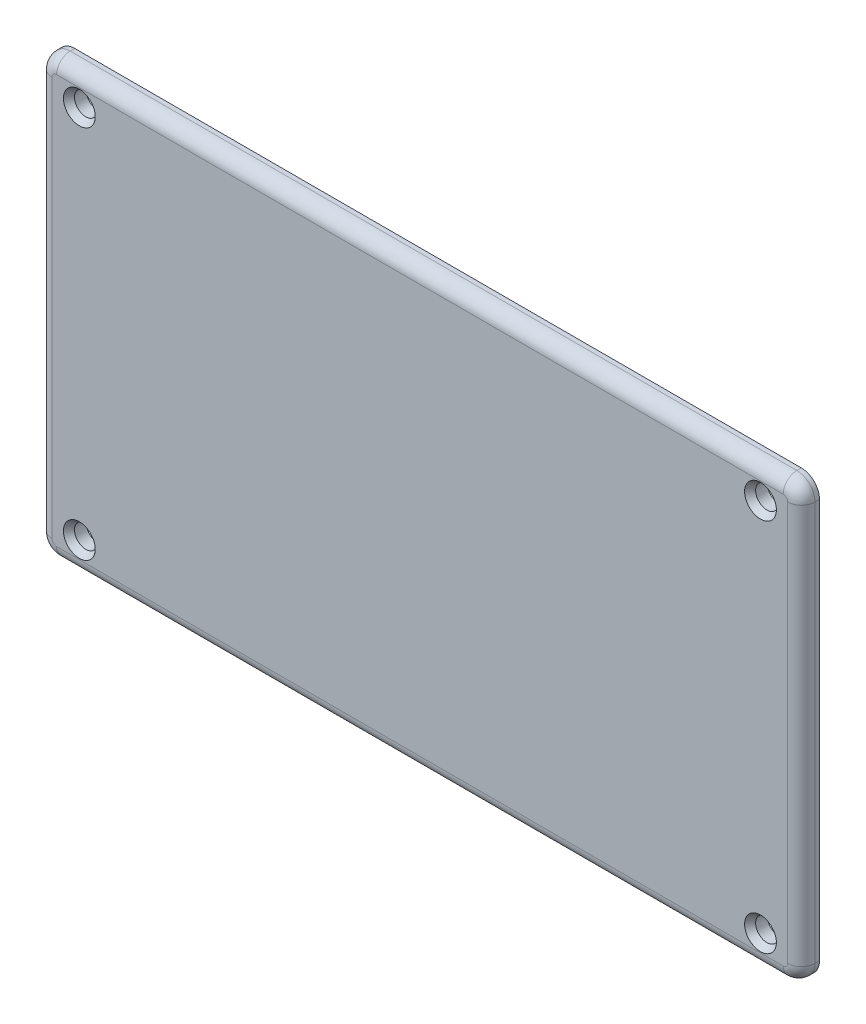
ISO-10303-21;
HEADER;
FILE_DESCRIPTION(('STEP AP214'),'2;1');
FILE_NAME('part.step','',(''),(''),'','','');
FILE_SCHEMA(('AUTOMOTIVE_DESIGN { 1 0 10303 214 1 1 1 1 }'));
ENDSEC;
DATA;
#1=APPLICATION_CONTEXT('core data for automotive mechanical design processes');
#2=APPLICATION_PROTOCOL_DEFINITION('international standard','automotive_design',2000,#1);
#3=PRODUCT_CONTEXT('',#1,'mechanical');
#4=PRODUCT('Part','Part','',(#3));
#5=PRODUCT_RELATED_PRODUCT_CATEGORY('part','',(#4));
#6=PRODUCT_DEFINITION_FORMATION('','',#4);
#7=PRODUCT_DEFINITION_CONTEXT('part definition',#1,'design');
#8=PRODUCT_DEFINITION('design','',#6,#7);
#9=PRODUCT_DEFINITION_SHAPE('','',#8);
#10=(LENGTH_UNIT() NAMED_UNIT(*) SI_UNIT(.MILLI.,.METRE.));
#11=(NAMED_UNIT(*) PLANE_ANGLE_UNIT() SI_UNIT($,.RADIAN.));
#12=(NAMED_UNIT(*) SI_UNIT($,.STERADIAN.) SOLID_ANGLE_UNIT());
#13=UNCERTAINTY_MEASURE_WITH_UNIT(LENGTH_MEASURE(1.E-05),#10,'distance_accuracy_value','');
#14=(GEOMETRIC_REPRESENTATION_CONTEXT(3) GLOBAL_UNCERTAINTY_ASSIGNED_CONTEXT((#13)) GLOBAL_UNIT_ASSIGNED_CONTEXT((#10,
#11,#12)) REPRESENTATION_CONTEXT('',''));
#15=CARTESIAN_POINT('',(0.,0.,0.));
#16=DIRECTION('',(0.,0.,1.));
#17=DIRECTION('',(1.,0.,0.));
#18=AXIS2_PLACEMENT_3D('',#15,#16,#17);
#19=CARTESIAN_POINT('',(-40.,22.,-21.3853659787079));
#20=DIRECTION('',(0.,0.,1.));
#21=DIRECTION('',(1.,0.,0.));
#22=AXIS2_PLACEMENT_3D('',#19,#20,#21);
#23=PLANE('',#22);
#24=CARTESIAN_POINT('',(37.5,20.625,-21.3853659787079));
#25=DIRECTION('',(0.,0.,1.));
#26=DIRECTION('',(1.,0.,0.));
#27=AXIS2_PLACEMENT_3D('',#24,#25,#26);
#28=CIRCLE('',#27,1.75);
#29=CARTESIAN_POINT('',(39.25,20.625,-21.3853659787079));
#30=VERTEX_POINT('',#29);
#31=EDGE_CURVE('E258',#30,#30,#28,.F.);
#32=ORIENTED_EDGE('',*,*,#31,.T.);
#33=EDGE_LOOP('',(#32));
#34=FACE_BOUND('',#33,.T.);
#35=CARTESIAN_POINT('',(37.5,-20.625,-21.3853659787079));
#36=DIRECTION('',(0.,0.,1.));
#37=DIRECTION('',(1.,0.,0.));
#38=AXIS2_PLACEMENT_3D('',#35,#36,#37);
#39=CIRCLE('',#38,1.75);
#40=CARTESIAN_POINT('',(39.25,-20.625,-21.3853659787079));
#41=VERTEX_POINT('',#40);
#42=EDGE_CURVE('E255',#41,#41,#39,.F.);
#43=ORIENTED_EDGE('',*,*,#42,.T.);
#44=EDGE_LOOP('',(#43));
#45=FACE_BOUND('',#44,.T.);
#46=CARTESIAN_POINT('',(-37.5,-20.625,-21.3853659787079));
#47=DIRECTION('',(0.,0.,1.));
#48=DIRECTION('',(1.,0.,0.));
#49=AXIS2_PLACEMENT_3D('',#46,#47,#48);
#50=CIRCLE('',#49,1.74999999999999);
#51=CARTESIAN_POINT('',(-35.75,-20.625,-21.3853659787079));
#52=VERTEX_POINT('',#51);
#53=EDGE_CURVE('E252',#52,#52,#50,.F.);
#54=ORIENTED_EDGE('',*,*,#53,.T.);
#55=EDGE_LOOP('',(#54));
#56=FACE_BOUND('',#55,.T.);
#57=CARTESIAN_POINT('',(-37.5,20.625,-21.3853659787079));
#58=DIRECTION('',(0.,0.,1.));
#59=DIRECTION('',(1.,0.,0.));
#60=AXIS2_PLACEMENT_3D('',#57,#58,#59);
#61=CIRCLE('',#60,1.74999999999999);
#62=CARTESIAN_POINT('',(-35.75,20.625,-21.3853659787079));
#63=VERTEX_POINT('',#62);
#64=EDGE_CURVE('E249',#63,#63,#61,.F.);
#65=ORIENTED_EDGE('',*,*,#64,.T.);
#66=EDGE_LOOP('',(#65));
#67=FACE_BOUND('',#66,.T.);
#68=DIRECTION('',(-1.,0.,0.));
#69=VECTOR('',#68,1.);
#70=CARTESIAN_POINT('',(-40.,22.5,-21.3853659787079));
#71=LINE('',#70,#69);
#72=CARTESIAN_POINT('',(40.,22.5,-21.3853659787079));
#73=VERTEX_POINT('',#72);
#74=CARTESIAN_POINT('',(-40.,22.5,-21.3853659787079));
#75=VERTEX_POINT('',#74);
#76=EDGE_CURVE('E205',#73,#75,#71,.T.);
#77=ORIENTED_EDGE('',*,*,#76,.T.);
#78=CARTESIAN_POINT('',(-40.,22.,-21.3853659787079));
#79=DIRECTION('',(0.,0.,1.));
#80=DIRECTION('',(1.,0.,0.));
#81=AXIS2_PLACEMENT_3D('',#78,#79,#80);
#82=CIRCLE('',#81,0.5);
#83=CARTESIAN_POINT('',(-40.5,22.,-21.3853659787079));
#84=VERTEX_POINT('',#83);
#85=EDGE_CURVE('E207',#75,#84,#82,.T.);
#86=ORIENTED_EDGE('',*,*,#85,.T.);
#87=DIRECTION('',(0.,-1.,0.));
#88=VECTOR('',#87,1.);
#89=CARTESIAN_POINT('',(-40.5,-22.,-21.3853659787079));
#90=LINE('',#89,#88);
#91=CARTESIAN_POINT('',(-40.5,-22.,-21.3853659787079));
#92=VERTEX_POINT('',#91);
#93=EDGE_CURVE('E197',#84,#92,#90,.T.);
#94=ORIENTED_EDGE('',*,*,#93,.T.);
#95=CARTESIAN_POINT('',(-40.,-22.,-21.3853659787079));
#96=DIRECTION('',(0.,0.,1.));
#97=DIRECTION('',(1.,0.,0.));
#98=AXIS2_PLACEMENT_3D('',#95,#96,#97);
#99=CIRCLE('',#98,0.500000000000002);
#100=CARTESIAN_POINT('',(-40.,-22.5,-21.3853659787079));
#101=VERTEX_POINT('',#100);
#102=EDGE_CURVE('E195',#92,#101,#99,.T.);
#103=ORIENTED_EDGE('',*,*,#102,.T.);
#104=DIRECTION('',(1.,0.,0.));
#105=VECTOR('',#104,1.);
#106=CARTESIAN_POINT('',(40.,-22.5,-21.3853659787079));
#107=LINE('',#106,#105);
#108=CARTESIAN_POINT('',(40.,-22.5,-21.3853659787079));
#109=VERTEX_POINT('',#108);
#110=EDGE_CURVE('E143',#101,#109,#107,.T.);
#111=ORIENTED_EDGE('',*,*,#110,.T.);
#112=CARTESIAN_POINT('',(40.,-22.,-21.3853659787079));
#113=DIRECTION('',(0.,0.,1.));
#114=DIRECTION('',(1.,0.,0.));
#115=AXIS2_PLACEMENT_3D('',#112,#113,#114);
#116=CIRCLE('',#115,0.5);
#117=CARTESIAN_POINT('',(40.5,-22.,-21.3853659787079));
#118=VERTEX_POINT('',#117);
#119=EDGE_CURVE('E199',#109,#118,#116,.T.);
#120=ORIENTED_EDGE('',*,*,#119,.T.);
#121=DIRECTION('',(0.,1.,0.));
#122=VECTOR('',#121,1.);
#123=CARTESIAN_POINT('',(40.5,22.,-21.3853659787079));
#124=LINE('',#123,#122);
#125=CARTESIAN_POINT('',(40.5,22.,-21.3853659787079));
#126=VERTEX_POINT('',#125);
#127=EDGE_CURVE('E201',#118,#126,#124,.T.);
#128=ORIENTED_EDGE('',*,*,#127,.T.);
#129=CARTESIAN_POINT('',(40.,22.,-21.3853659787079));
#130=DIRECTION('',(0.,0.,1.));
#131=DIRECTION('',(1.,0.,0.));
#132=AXIS2_PLACEMENT_3D('',#129,#130,#131);
#133=CIRCLE('',#132,0.5);
#134=EDGE_CURVE('E203',#126,#73,#133,.T.);
#135=ORIENTED_EDGE('',*,*,#134,.T.);
#136=EDGE_LOOP('',(#77,#86,#94,#103,#111,#120,#128,#135));
#137=FACE_BOUND('',#136,.T.);
#138=ADVANCED_FACE('F41',(#34,#45,#56,#67,#137),#23,.T.);
#139=CARTESIAN_POINT('',(-40.,22.,-23.3853659787079));
#140=DIRECTION('',(0.,0.,1.));
#141=DIRECTION('',(1.,0.,0.));
#142=AXIS2_PLACEMENT_3D('',#139,#140,#141);
#143=PLANE('',#142);
#144=CARTESIAN_POINT('',(-40.,22.,-23.3853659787079));
#145=DIRECTION('',(0.,0.,1.));
#146=DIRECTION('',(1.,0.,0.));
#147=AXIS2_PLACEMENT_3D('',#144,#145,#146);
#148=CIRCLE('',#147,2.);
#149=CARTESIAN_POINT('',(-40.,24.,-23.3853659787079));
#150=VERTEX_POINT('',#149);
#151=CARTESIAN_POINT('',(-42.,22.,-23.3853659787079));
#152=VERTEX_POINT('',#151);
#153=EDGE_CURVE('E151',#150,#152,#148,.T.);
#154=ORIENTED_EDGE('',*,*,#153,.F.);
#155=DIRECTION('',(-1.,0.,0.));
#156=VECTOR('',#155,1.);
#157=CARTESIAN_POINT('',(40.,24.,-23.3853659787079));
#158=LINE('',#157,#156);
#159=CARTESIAN_POINT('',(40.,24.,-23.3853659787079));
#160=VERTEX_POINT('',#159);
#161=EDGE_CURVE('E180',#160,#150,#158,.T.);
#162=ORIENTED_EDGE('',*,*,#161,.F.);
#163=CARTESIAN_POINT('',(40.,22.,-23.3853659787079));
#164=DIRECTION('',(0.,0.,1.));
#165=DIRECTION('',(1.,0.,0.));
#166=AXIS2_PLACEMENT_3D('',#163,#164,#165);
#167=CIRCLE('',#166,2.);
#168=CARTESIAN_POINT('',(42.,22.,-23.3853659787079));
#169=VERTEX_POINT('',#168);
#170=EDGE_CURVE('E177',#169,#160,#167,.T.);
#171=ORIENTED_EDGE('',*,*,#170,.F.);
#172=DIRECTION('',(0.,1.,0.));
#173=VECTOR('',#172,1.);
#174=CARTESIAN_POINT('',(42.,-22.,-23.3853659787079));
#175=LINE('',#174,#173);
#176=CARTESIAN_POINT('',(42.,-22.,-23.3853659787079));
#177=VERTEX_POINT('',#176);
#178=EDGE_CURVE('E174',#177,#169,#175,.T.);
#179=ORIENTED_EDGE('',*,*,#178,.F.);
#180=CARTESIAN_POINT('',(40.,-22.,-23.3853659787079));
#181=DIRECTION('',(0.,0.,1.));
#182=DIRECTION('',(1.,0.,0.));
#183=AXIS2_PLACEMENT_3D('',#180,#181,#182);
#184=CIRCLE('',#183,2.);
#185=CARTESIAN_POINT('',(40.,-24.,-23.3853659787079));
#186=VERTEX_POINT('',#185);
#187=EDGE_CURVE('E171',#186,#177,#184,.T.);
#188=ORIENTED_EDGE('',*,*,#187,.F.);
#189=DIRECTION('',(1.,0.,0.));
#190=VECTOR('',#189,1.);
#191=CARTESIAN_POINT('',(-40.,-24.,-23.3853659787079));
#192=LINE('',#191,#190);
#193=CARTESIAN_POINT('',(-40.,-24.,-23.3853659787079));
#194=VERTEX_POINT('',#193);
#195=EDGE_CURVE('E168',#194,#186,#192,.T.);
#196=ORIENTED_EDGE('',*,*,#195,.F.);
#197=CARTESIAN_POINT('',(-40.,-22.,-23.3853659787079));
#198=DIRECTION('',(0.,0.,1.));
#199=DIRECTION('',(1.,0.,0.));
#200=AXIS2_PLACEMENT_3D('',#197,#198,#199);
#201=CIRCLE('',#200,2.);
#202=CARTESIAN_POINT('',(-42.,-22.,-23.3853659787079));
#203=VERTEX_POINT('',#202);
#204=EDGE_CURVE('E154',#203,#194,#201,.T.);
#205=ORIENTED_EDGE('',*,*,#204,.F.);
#206=DIRECTION('',(0.,-1.,0.));
#207=VECTOR('',#206,1.);
#208=CARTESIAN_POINT('',(-42.,22.,-23.3853659787079));
#209=LINE('',#208,#207);
#210=EDGE_CURVE('E135',#152,#203,#209,.T.);
#211=ORIENTED_EDGE('',*,*,#210,.F.);
#212=EDGE_LOOP('',(#154,#162,#171,#179,#188,#196,#205,#211));
#213=FACE_BOUND('',#212,.T.);
#214=CARTESIAN_POINT('',(37.5,-20.625,-23.3853659787079));
#215=DIRECTION('',(0.,0.,1.));
#216=DIRECTION('',(1.,0.,0.));
#217=AXIS2_PLACEMENT_3D('',#214,#215,#216);
#218=CIRCLE('',#217,1.25);
#219=CARTESIAN_POINT('',(38.75,-20.625,-23.3853659787079));
#220=VERTEX_POINT('',#219);
#221=EDGE_CURVE('E160',#220,#220,#218,.T.);
#222=ORIENTED_EDGE('',*,*,#221,.T.);
#223=EDGE_LOOP('',(#222));
#224=FACE_BOUND('',#223,.T.);
#225=CARTESIAN_POINT('',(-37.5,-20.625,-23.3853659787079));
#226=DIRECTION('',(0.,0.,1.));
#227=DIRECTION('',(1.,0.,0.));
#228=AXIS2_PLACEMENT_3D('',#225,#226,#227);
#229=CIRCLE('',#228,1.25);
#230=CARTESIAN_POINT('',(-36.25,-20.625,-23.3853659787079));
#231=VERTEX_POINT('',#230);
#232=EDGE_CURVE('E163',#231,#231,#229,.T.);
#233=ORIENTED_EDGE('',*,*,#232,.T.);
#234=EDGE_LOOP('',(#233));
#235=FACE_BOUND('',#234,.T.);
#236=CARTESIAN_POINT('',(37.5,20.625,-23.3853659787079));
#237=DIRECTION('',(0.,0.,1.));
#238=DIRECTION('',(1.,0.,0.));
#239=AXIS2_PLACEMENT_3D('',#236,#237,#238);
#240=CIRCLE('',#239,1.25);
#241=CARTESIAN_POINT('',(38.75,20.625,-23.3853659787079));
#242=VERTEX_POINT('',#241);
#243=EDGE_CURVE('E378',#242,#242,#240,.T.);
#244=ORIENTED_EDGE('',*,*,#243,.T.);
#245=EDGE_LOOP('',(#244));
#246=FACE_BOUND('',#245,.T.);
#247=CARTESIAN_POINT('',(-37.5,20.625,-23.3853659787079));
#248=DIRECTION('',(0.,0.,1.));
#249=DIRECTION('',(1.,0.,0.));
#250=AXIS2_PLACEMENT_3D('',#247,#248,#249);
#251=CIRCLE('',#250,1.25);
#252=CARTESIAN_POINT('',(-36.25,20.625,-23.3853659787079));
#253=VERTEX_POINT('',#252);
#254=EDGE_CURVE('E246',#253,#253,#251,.T.);
#255=ORIENTED_EDGE('',*,*,#254,.T.);
#256=EDGE_LOOP('',(#255));
#257=FACE_BOUND('',#256,.T.);
#258=ADVANCED_FACE('F148',(#213,#224,#235,#246,#257),#143,.F.);
#259=CARTESIAN_POINT('',(-40.,22.,-21.3853659787079));
#260=DIRECTION('',(0.,0.,-1.));
#261=DIRECTION('',(-1.,0.,0.));
#262=AXIS2_PLACEMENT_3D('',#259,#260,#261);
#263=CYLINDRICAL_SURFACE('',#262,2.);
#264=DIRECTION('',(0.,0.,-1.));
#265=VECTOR('',#264,1.);
#266=CARTESIAN_POINT('',(-42.,22.,-21.3853659787079));
#267=LINE('',#266,#265);
#268=CARTESIAN_POINT('',(-42.,22.,-22.8853659787079));
#269=VERTEX_POINT('',#268);
#270=EDGE_CURVE('E132',#269,#152,#267,.T.);
#271=ORIENTED_EDGE('',*,*,#270,.F.);
#272=CARTESIAN_POINT('',(-40.,22.,-22.8853659787079));
#273=DIRECTION('',(0.,0.,1.));
#274=DIRECTION('',(1.,0.,0.));
#275=AXIS2_PLACEMENT_3D('',#272,#273,#274);
#276=CIRCLE('',#275,2.);
#277=CARTESIAN_POINT('',(-40.,24.,-22.8853659787079));
#278=VERTEX_POINT('',#277);
#279=EDGE_CURVE('E210',#269,#278,#276,.F.);
#280=ORIENTED_EDGE('',*,*,#279,.T.);
#281=DIRECTION('',(0.,0.,-1.));
#282=VECTOR('',#281,1.);
#283=CARTESIAN_POINT('',(-40.,24.,-21.3853659787079));
#284=LINE('',#283,#282);
#285=EDGE_CURVE('E158',#278,#150,#284,.T.);
#286=ORIENTED_EDGE('',*,*,#285,.T.);
#287=ORIENTED_EDGE('',*,*,#153,.T.);
#288=EDGE_LOOP('',(#271,#280,#286,#287));
#289=FACE_BOUND('',#288,.T.);
#290=ADVANCED_FACE('F156',(#289),#263,.T.);
#291=CARTESIAN_POINT('',(-42.,22.,-21.3853659787079));
#292=DIRECTION('',(1.,0.,0.));
#293=DIRECTION('',(0.,0.,-1.));
#294=AXIS2_PLACEMENT_3D('',#291,#292,#293);
#295=PLANE('',#294);
#296=DIRECTION('',(0.,0.,-1.));
#297=VECTOR('',#296,1.);
#298=CARTESIAN_POINT('',(-42.,-22.,-21.3853659787079));
#299=LINE('',#298,#297);
#300=CARTESIAN_POINT('',(-42.,-22.,-22.8853659787079));
#301=VERTEX_POINT('',#300);
#302=EDGE_CURVE('E144',#301,#203,#299,.T.);
#303=ORIENTED_EDGE('',*,*,#302,.F.);
#304=DIRECTION('',(0.,-1.,0.));
#305=VECTOR('',#304,1.);
#306=CARTESIAN_POINT('',(-42.,22.,-22.8853659787079));
#307=LINE('',#306,#305);
#308=EDGE_CURVE('E138',#301,#269,#307,.F.);
#309=ORIENTED_EDGE('',*,*,#308,.T.);
#310=ORIENTED_EDGE('',*,*,#270,.T.);
#311=ORIENTED_EDGE('',*,*,#210,.T.);
#312=EDGE_LOOP('',(#303,#309,#310,#311));
#313=FACE_BOUND('',#312,.T.);
#314=ADVANCED_FACE('F134',(#313),#295,.F.);
#315=CARTESIAN_POINT('',(-40.,-22.,-21.3853659787079));
#316=DIRECTION('',(0.,0.,-1.));
#317=DIRECTION('',(-1.,0.,0.));
#318=AXIS2_PLACEMENT_3D('',#315,#316,#317);
#319=CYLINDRICAL_SURFACE('',#318,2.);
#320=DIRECTION('',(0.,0.,-1.));
#321=VECTOR('',#320,1.);
#322=CARTESIAN_POINT('',(-40.,-24.,-21.3853659787079));
#323=LINE('',#322,#321);
#324=CARTESIAN_POINT('',(-40.,-24.,-22.8853659787079));
#325=VERTEX_POINT('',#324);
#326=EDGE_CURVE('E191',#325,#194,#323,.T.);
#327=ORIENTED_EDGE('',*,*,#326,.F.);
#328=CARTESIAN_POINT('',(-40.,-22.,-22.8853659787079));
#329=DIRECTION('',(0.,0.,1.));
#330=DIRECTION('',(1.,0.,0.));
#331=AXIS2_PLACEMENT_3D('',#328,#329,#330);
#332=CIRCLE('',#331,2.);
#333=EDGE_CURVE('E64',#325,#301,#332,.F.);
#334=ORIENTED_EDGE('',*,*,#333,.T.);
#335=ORIENTED_EDGE('',*,*,#302,.T.);
#336=ORIENTED_EDGE('',*,*,#204,.T.);
#337=EDGE_LOOP('',(#327,#334,#335,#336));
#338=FACE_BOUND('',#337,.T.);
#339=ADVANCED_FACE('F314',(#338),#319,.T.);
#340=CARTESIAN_POINT('',(-40.,-24.,-21.3853659787079));
#341=DIRECTION('',(0.,1.,0.));
#342=DIRECTION('',(-1.,0.,0.));
#343=AXIS2_PLACEMENT_3D('',#340,#341,#342);
#344=PLANE('',#343);
#345=DIRECTION('',(0.,0.,-1.));
#346=VECTOR('',#345,1.);
#347=CARTESIAN_POINT('',(40.,-24.,-21.3853659787079));
#348=LINE('',#347,#346);
#349=CARTESIAN_POINT('',(40.,-24.,-22.8853659787079));
#350=VERTEX_POINT('',#349);
#351=EDGE_CURVE('E189',#350,#186,#348,.T.);
#352=ORIENTED_EDGE('',*,*,#351,.F.);
#353=DIRECTION('',(1.,0.,0.));
#354=VECTOR('',#353,1.);
#355=CARTESIAN_POINT('',(-40.,-24.,-22.8853659787079));
#356=LINE('',#355,#354);
#357=EDGE_CURVE('E57',#350,#325,#356,.F.);
#358=ORIENTED_EDGE('',*,*,#357,.T.);
#359=ORIENTED_EDGE('',*,*,#326,.T.);
#360=ORIENTED_EDGE('',*,*,#195,.T.);
#361=EDGE_LOOP('',(#352,#358,#359,#360));
#362=FACE_BOUND('',#361,.T.);
#363=ADVANCED_FACE('F310',(#362),#344,.F.);
#364=CARTESIAN_POINT('',(40.,-22.,-21.3853659787079));
#365=DIRECTION('',(0.,0.,-1.));
#366=DIRECTION('',(-1.,0.,0.));
#367=AXIS2_PLACEMENT_3D('',#364,#365,#366);
#368=CYLINDRICAL_SURFACE('',#367,2.);
#369=DIRECTION('',(0.,0.,-1.));
#370=VECTOR('',#369,1.);
#371=CARTESIAN_POINT('',(42.,-22.,-21.3853659787079));
#372=LINE('',#371,#370);
#373=CARTESIAN_POINT('',(42.,-22.,-22.8853659787079));
#374=VERTEX_POINT('',#373);
#375=EDGE_CURVE('E187',#374,#177,#372,.T.);
#376=ORIENTED_EDGE('',*,*,#375,.F.);
#377=CARTESIAN_POINT('',(40.,-22.,-22.8853659787079));
#378=DIRECTION('',(0.,0.,1.));
#379=DIRECTION('',(1.,0.,0.));
#380=AXIS2_PLACEMENT_3D('',#377,#378,#379);
#381=CIRCLE('',#380,2.);
#382=EDGE_CURVE('E218',#374,#350,#381,.F.);
#383=ORIENTED_EDGE('',*,*,#382,.T.);
#384=ORIENTED_EDGE('',*,*,#351,.T.);
#385=ORIENTED_EDGE('',*,*,#187,.T.);
#386=EDGE_LOOP('',(#376,#383,#384,#385));
#387=FACE_BOUND('',#386,.T.);
#388=ADVANCED_FACE('F306',(#387),#368,.T.);
#389=CARTESIAN_POINT('',(42.,-22.,-21.3853659787079));
#390=DIRECTION('',(-1.,0.,0.));
#391=DIRECTION('',(0.,0.,1.));
#392=AXIS2_PLACEMENT_3D('',#389,#390,#391);
#393=PLANE('',#392);
#394=DIRECTION('',(0.,0.,-1.));
#395=VECTOR('',#394,1.);
#396=CARTESIAN_POINT('',(42.,22.,-21.3853659787079));
#397=LINE('',#396,#395);
#398=CARTESIAN_POINT('',(42.,22.,-22.8853659787079));
#399=VERTEX_POINT('',#398);
#400=EDGE_CURVE('E185',#399,#169,#397,.T.);
#401=ORIENTED_EDGE('',*,*,#400,.F.);
#402=DIRECTION('',(0.,1.,0.));
#403=VECTOR('',#402,1.);
#404=CARTESIAN_POINT('',(42.,-22.,-22.8853659787079));
#405=LINE('',#404,#403);
#406=EDGE_CURVE('E216',#399,#374,#405,.F.);
#407=ORIENTED_EDGE('',*,*,#406,.T.);
#408=ORIENTED_EDGE('',*,*,#375,.T.);
#409=ORIENTED_EDGE('',*,*,#178,.T.);
#410=EDGE_LOOP('',(#401,#407,#408,#409));
#411=FACE_BOUND('',#410,.T.);
#412=ADVANCED_FACE('F302',(#411),#393,.F.);
#413=CARTESIAN_POINT('',(40.,22.,-21.3853659787079));
#414=DIRECTION('',(0.,0.,-1.));
#415=DIRECTION('',(-1.,0.,0.));
#416=AXIS2_PLACEMENT_3D('',#413,#414,#415);
#417=CYLINDRICAL_SURFACE('',#416,2.);
#418=DIRECTION('',(0.,0.,-1.));
#419=VECTOR('',#418,1.);
#420=CARTESIAN_POINT('',(40.,24.,-21.3853659787079));
#421=LINE('',#420,#419);
#422=CARTESIAN_POINT('',(40.,24.,-22.8853659787079));
#423=VERTEX_POINT('',#422);
#424=EDGE_CURVE('E183',#423,#160,#421,.T.);
#425=ORIENTED_EDGE('',*,*,#424,.F.);
#426=CARTESIAN_POINT('',(40.,22.,-22.8853659787079));
#427=DIRECTION('',(0.,0.,1.));
#428=DIRECTION('',(1.,0.,0.));
#429=AXIS2_PLACEMENT_3D('',#426,#427,#428);
#430=CIRCLE('',#429,2.);
#431=EDGE_CURVE('E214',#423,#399,#430,.F.);
#432=ORIENTED_EDGE('',*,*,#431,.T.);
#433=ORIENTED_EDGE('',*,*,#400,.T.);
#434=ORIENTED_EDGE('',*,*,#170,.T.);
#435=EDGE_LOOP('',(#425,#432,#433,#434));
#436=FACE_BOUND('',#435,.T.);
#437=ADVANCED_FACE('F298',(#436),#417,.T.);
#438=CARTESIAN_POINT('',(40.,24.,-21.3853659787079));
#439=DIRECTION('',(0.,-1.,0.));
#440=DIRECTION('',(0.,0.,-1.));
#441=AXIS2_PLACEMENT_3D('',#438,#439,#440);
#442=PLANE('',#441);
#443=ORIENTED_EDGE('',*,*,#285,.F.);
#444=DIRECTION('',(-1.,0.,0.));
#445=VECTOR('',#444,1.);
#446=CARTESIAN_POINT('',(40.,24.,-22.8853659787079));
#447=LINE('',#446,#445);
#448=EDGE_CURVE('E212',#278,#423,#447,.F.);
#449=ORIENTED_EDGE('',*,*,#448,.T.);
#450=ORIENTED_EDGE('',*,*,#424,.T.);
#451=ORIENTED_EDGE('',*,*,#161,.T.);
#452=EDGE_LOOP('',(#443,#449,#450,#451));
#453=FACE_BOUND('',#452,.T.);
#454=ADVANCED_FACE('F295',(#453),#442,.F.);
#455=CARTESIAN_POINT('',(37.5,-20.625,-21.3853659787079));
#456=DIRECTION('',(0.,0.,-1.));
#457=DIRECTION('',(-1.,0.,0.));
#458=AXIS2_PLACEMENT_3D('',#455,#456,#457);
#459=CYLINDRICAL_SURFACE('',#458,1.25);
#460=CARTESIAN_POINT('',(37.5,-20.625,-22.0994399820789));
#461=DIRECTION('',(0.,0.,1.));
#462=DIRECTION('',(1.,0.,0.));
#463=AXIS2_PLACEMENT_3D('',#460,#461,#462);
#464=CIRCLE('',#463,1.25);
#465=CARTESIAN_POINT('',(38.75,-20.625,-22.0994399820789));
#466=VERTEX_POINT('',#465);
#467=EDGE_CURVE('E261',#466,#466,#464,.T.);
#468=ORIENTED_EDGE('',*,*,#467,.T.);
#469=EDGE_LOOP('',(#468));
#470=FACE_BOUND('',#469,.T.);
#471=ORIENTED_EDGE('',*,*,#221,.F.);
#472=EDGE_LOOP('',(#471));
#473=FACE_BOUND('',#472,.T.);
#474=ADVANCED_FACE('F292',(#470,#473),#459,.F.);
#475=CARTESIAN_POINT('',(-37.5,-20.625,-21.3853659787079));
#476=DIRECTION('',(0.,0.,-1.));
#477=DIRECTION('',(-1.,0.,0.));
#478=AXIS2_PLACEMENT_3D('',#475,#476,#477);
#479=CYLINDRICAL_SURFACE('',#478,1.25);
#480=CARTESIAN_POINT('',(-37.5,-20.625,-22.0994399820789));
#481=DIRECTION('',(0.,0.,1.));
#482=DIRECTION('',(1.,0.,0.));
#483=AXIS2_PLACEMENT_3D('',#480,#481,#482);
#484=CIRCLE('',#483,1.25);
#485=CARTESIAN_POINT('',(-36.25,-20.625,-22.0994399820789));
#486=VERTEX_POINT('',#485);
#487=EDGE_CURVE('E50',#486,#486,#484,.T.);
#488=ORIENTED_EDGE('',*,*,#487,.T.);
#489=EDGE_LOOP('',(#488));
#490=FACE_BOUND('',#489,.T.);
#491=ORIENTED_EDGE('',*,*,#232,.F.);
#492=EDGE_LOOP('',(#491));
#493=FACE_BOUND('',#492,.T.);
#494=ADVANCED_FACE('F266',(#490,#493),#479,.F.);
#495=CARTESIAN_POINT('',(37.5,20.625,-21.3853659787079));
#496=DIRECTION('',(0.,0.,-1.));
#497=DIRECTION('',(-1.,0.,0.));
#498=AXIS2_PLACEMENT_3D('',#495,#496,#497);
#499=CYLINDRICAL_SURFACE('',#498,1.25);
#500=CARTESIAN_POINT('',(37.5,20.625,-22.0994399820789));
#501=DIRECTION('',(0.,0.,1.));
#502=DIRECTION('',(1.,0.,0.));
#503=AXIS2_PLACEMENT_3D('',#500,#501,#502);
#504=CIRCLE('',#503,1.25);
#505=CARTESIAN_POINT('',(38.75,20.625,-22.0994399820789));
#506=VERTEX_POINT('',#505);
#507=EDGE_CURVE('E223',#506,#506,#504,.T.);
#508=ORIENTED_EDGE('',*,*,#507,.T.);
#509=EDGE_LOOP('',(#508));
#510=FACE_BOUND('',#509,.T.);
#511=ORIENTED_EDGE('',*,*,#243,.F.);
#512=EDGE_LOOP('',(#511));
#513=FACE_BOUND('',#512,.T.);
#514=ADVANCED_FACE('F372',(#510,#513),#499,.F.);
#515=CARTESIAN_POINT('',(-37.5,20.625,-21.3853659787079));
#516=DIRECTION('',(0.,0.,-1.));
#517=DIRECTION('',(-1.,0.,0.));
#518=AXIS2_PLACEMENT_3D('',#515,#516,#517);
#519=CYLINDRICAL_SURFACE('',#518,1.25);
#520=CARTESIAN_POINT('',(-37.5,20.625,-22.0994399820789));
#521=DIRECTION('',(0.,0.,1.));
#522=DIRECTION('',(1.,0.,0.));
#523=AXIS2_PLACEMENT_3D('',#520,#521,#522);
#524=CIRCLE('',#523,1.25);
#525=CARTESIAN_POINT('',(-36.25,20.625,-22.0994399820789));
#526=VERTEX_POINT('',#525);
#527=EDGE_CURVE('E11',#526,#526,#524,.T.);
#528=ORIENTED_EDGE('',*,*,#527,.T.);
#529=EDGE_LOOP('',(#528));
#530=FACE_BOUND('',#529,.T.);
#531=ORIENTED_EDGE('',*,*,#254,.F.);
#532=EDGE_LOOP('',(#531));
#533=FACE_BOUND('',#532,.T.);
#534=ADVANCED_FACE('F352',(#530,#533),#519,.F.);
#535=CARTESIAN_POINT('',(40.,-22.,-22.8853659787079));
#536=DIRECTION('',(0.,0.,1.));
#537=DIRECTION('',(1.,0.,0.));
#538=AXIS2_PLACEMENT_3D('',#535,#536,#537);
#539=DEGENERATE_TOROIDAL_SURFACE('',#538,0.5,1.5,.T.);
#540=CARTESIAN_POINT('',(40.,-22.5,-22.8853659787079));
#541=DIRECTION('',(-1.,0.,0.));
#542=DIRECTION('',(0.,-1.,0.));
#543=AXIS2_PLACEMENT_3D('',#540,#541,#542);
#544=CIRCLE('',#543,1.5);
#545=EDGE_CURVE('E240',#350,#109,#544,.T.);
#546=ORIENTED_EDGE('',*,*,#545,.F.);
#547=ORIENTED_EDGE('',*,*,#382,.F.);
#548=CARTESIAN_POINT('',(40.5,-22.,-22.8853659787079));
#549=DIRECTION('',(0.,1.,0.));
#550=DIRECTION('',(0.,0.,1.));
#551=AXIS2_PLACEMENT_3D('',#548,#549,#550);
#552=CIRCLE('',#551,1.5);
#553=EDGE_CURVE('E243',#118,#374,#552,.T.);
#554=ORIENTED_EDGE('',*,*,#553,.F.);
#555=ORIENTED_EDGE('',*,*,#119,.F.);
#556=EDGE_LOOP('',(#546,#547,#554,#555));
#557=FACE_BOUND('',#556,.T.);
#558=ADVANCED_FACE('F348',(#557),#539,.T.);
#559=CARTESIAN_POINT('',(40.5,22.,-22.8853659787079));
#560=DIRECTION('',(0.,-1.,0.));
#561=DIRECTION('',(0.,0.,-1.));
#562=AXIS2_PLACEMENT_3D('',#559,#560,#561);
#563=CYLINDRICAL_SURFACE('',#562,1.5);
#564=ORIENTED_EDGE('',*,*,#553,.T.);
#565=ORIENTED_EDGE('',*,*,#406,.F.);
#566=CARTESIAN_POINT('',(40.5,22.,-22.8853659787079));
#567=DIRECTION('',(0.,1.,0.));
#568=DIRECTION('',(-1.,0.,0.));
#569=AXIS2_PLACEMENT_3D('',#566,#567,#568);
#570=CIRCLE('',#569,1.5);
#571=EDGE_CURVE('E237',#126,#399,#570,.T.);
#572=ORIENTED_EDGE('',*,*,#571,.F.);
#573=ORIENTED_EDGE('',*,*,#127,.F.);
#574=EDGE_LOOP('',(#564,#565,#572,#573));
#575=FACE_BOUND('',#574,.T.);
#576=ADVANCED_FACE('F344',(#575),#563,.T.);
#577=CARTESIAN_POINT('',(-40.,-22.5,-22.8853659787079));
#578=DIRECTION('',(-1.,0.,0.));
#579=DIRECTION('',(0.,-1.,0.));
#580=AXIS2_PLACEMENT_3D('',#577,#578,#579);
#581=CYLINDRICAL_SURFACE('',#580,1.5);
#582=ORIENTED_EDGE('',*,*,#545,.T.);
#583=ORIENTED_EDGE('',*,*,#110,.F.);
#584=CARTESIAN_POINT('',(-40.,-22.5,-22.8853659787079));
#585=DIRECTION('',(-1.,0.,0.));
#586=DIRECTION('',(0.,0.,1.));
#587=AXIS2_PLACEMENT_3D('',#584,#585,#586);
#588=CIRCLE('',#587,1.5);
#589=EDGE_CURVE('E234',#325,#101,#588,.T.);
#590=ORIENTED_EDGE('',*,*,#589,.F.);
#591=ORIENTED_EDGE('',*,*,#357,.F.);
#592=EDGE_LOOP('',(#582,#583,#590,#591));
#593=FACE_BOUND('',#592,.T.);
#594=ADVANCED_FACE('F340',(#593),#581,.T.);
#595=CARTESIAN_POINT('',(40.,22.,-22.8853659787079));
#596=DIRECTION('',(0.,0.,1.));
#597=DIRECTION('',(1.,0.,0.));
#598=AXIS2_PLACEMENT_3D('',#595,#596,#597);
#599=DEGENERATE_TOROIDAL_SURFACE('',#598,0.5,1.5,.T.);
#600=ORIENTED_EDGE('',*,*,#571,.T.);
#601=ORIENTED_EDGE('',*,*,#431,.F.);
#602=CARTESIAN_POINT('',(40.,22.5,-22.8853659787079));
#603=DIRECTION('',(-1.,0.,0.));
#604=DIRECTION('',(0.,0.,1.));
#605=AXIS2_PLACEMENT_3D('',#602,#603,#604);
#606=CIRCLE('',#605,1.5);
#607=EDGE_CURVE('E231',#73,#423,#606,.T.);
#608=ORIENTED_EDGE('',*,*,#607,.F.);
#609=ORIENTED_EDGE('',*,*,#134,.F.);
#610=EDGE_LOOP('',(#600,#601,#608,#609));
#611=FACE_BOUND('',#610,.T.);
#612=ADVANCED_FACE('F336',(#611),#599,.T.);
#613=CARTESIAN_POINT('',(-40.,-22.,-22.8853659787079));
#614=DIRECTION('',(0.,0.,1.));
#615=DIRECTION('',(1.,0.,0.));
#616=AXIS2_PLACEMENT_3D('',#613,#614,#615);
#617=DEGENERATE_TOROIDAL_SURFACE('',#616,0.500000000000002,1.5,.T.);
#618=ORIENTED_EDGE('',*,*,#589,.T.);
#619=ORIENTED_EDGE('',*,*,#102,.F.);
#620=CARTESIAN_POINT('',(-40.5,-22.,-22.8853659787079));
#621=DIRECTION('',(0.,1.,0.));
#622=DIRECTION('',(0.,0.,1.));
#623=AXIS2_PLACEMENT_3D('',#620,#621,#622);
#624=CIRCLE('',#623,1.5);
#625=EDGE_CURVE('E228',#301,#92,#624,.T.);
#626=ORIENTED_EDGE('',*,*,#625,.F.);
#627=ORIENTED_EDGE('',*,*,#333,.F.);
#628=EDGE_LOOP('',(#618,#619,#626,#627));
#629=FACE_BOUND('',#628,.T.);
#630=ADVANCED_FACE('F332',(#629),#617,.T.);
#631=CARTESIAN_POINT('',(-40.,22.5,-22.8853659787079));
#632=DIRECTION('',(1.,0.,0.));
#633=DIRECTION('',(0.,0.,-1.));
#634=AXIS2_PLACEMENT_3D('',#631,#632,#633);
#635=CYLINDRICAL_SURFACE('',#634,1.5);
#636=ORIENTED_EDGE('',*,*,#607,.T.);
#637=ORIENTED_EDGE('',*,*,#448,.F.);
#638=CARTESIAN_POINT('',(-40.,22.5,-22.8853659787079));
#639=DIRECTION('',(-1.,0.,0.));
#640=DIRECTION('',(0.,-1.,0.));
#641=AXIS2_PLACEMENT_3D('',#638,#639,#640);
#642=CIRCLE('',#641,1.5);
#643=EDGE_CURVE('E226',#75,#278,#642,.T.);
#644=ORIENTED_EDGE('',*,*,#643,.F.);
#645=ORIENTED_EDGE('',*,*,#76,.F.);
#646=EDGE_LOOP('',(#636,#637,#644,#645));
#647=FACE_BOUND('',#646,.T.);
#648=ADVANCED_FACE('F328',(#647),#635,.T.);
#649=CARTESIAN_POINT('',(-40.5,22.,-22.8853659787079));
#650=DIRECTION('',(0.,1.,0.));
#651=DIRECTION('',(0.,0.,1.));
#652=AXIS2_PLACEMENT_3D('',#649,#650,#651);
#653=CYLINDRICAL_SURFACE('',#652,1.5);
#654=ORIENTED_EDGE('',*,*,#625,.T.);
#655=ORIENTED_EDGE('',*,*,#93,.F.);
#656=CARTESIAN_POINT('',(-40.5,22.,-22.8853659787079));
#657=DIRECTION('',(0.,1.,0.));
#658=DIRECTION('',(0.,0.,1.));
#659=AXIS2_PLACEMENT_3D('',#656,#657,#658);
#660=CIRCLE('',#659,1.5);
#661=EDGE_CURVE('E224',#269,#84,#660,.T.);
#662=ORIENTED_EDGE('',*,*,#661,.F.);
#663=ORIENTED_EDGE('',*,*,#308,.F.);
#664=EDGE_LOOP('',(#654,#655,#662,#663));
#665=FACE_BOUND('',#664,.T.);
#666=ADVANCED_FACE('F324',(#665),#653,.T.);
#667=CARTESIAN_POINT('',(-40.,22.,-22.8853659787079));
#668=DIRECTION('',(0.,0.,1.));
#669=DIRECTION('',(1.,0.,0.));
#670=AXIS2_PLACEMENT_3D('',#667,#668,#669);
#671=DEGENERATE_TOROIDAL_SURFACE('',#670,0.5,1.5,.T.);
#672=ORIENTED_EDGE('',*,*,#643,.T.);
#673=ORIENTED_EDGE('',*,*,#279,.F.);
#674=ORIENTED_EDGE('',*,*,#661,.T.);
#675=ORIENTED_EDGE('',*,*,#85,.F.);
#676=EDGE_LOOP('',(#672,#673,#674,#675));
#677=FACE_BOUND('',#676,.T.);
#678=ADVANCED_FACE('F321',(#677),#671,.T.);
#679=CARTESIAN_POINT('',(37.5,20.625,-22.0994399820789));
#680=DIRECTION('',(0.,0.,1.));
#681=DIRECTION('',(1.,0.,0.));
#682=AXIS2_PLACEMENT_3D('',#679,#680,#681);
#683=CONICAL_SURFACE('',#682,1.25,0.61086523819803);
#684=ORIENTED_EDGE('',*,*,#31,.F.);
#685=EDGE_LOOP('',(#684));
#686=FACE_BOUND('',#685,.T.);
#687=ORIENTED_EDGE('',*,*,#507,.F.);
#688=EDGE_LOOP('',(#687));
#689=FACE_BOUND('',#688,.T.);
#690=ADVANCED_FACE('F278',(#686,#689),#683,.F.);
#691=CARTESIAN_POINT('',(37.5,-20.625,-22.0994399820789));
#692=DIRECTION('',(0.,0.,1.));
#693=DIRECTION('',(1.,0.,0.));
#694=AXIS2_PLACEMENT_3D('',#691,#692,#693);
#695=CONICAL_SURFACE('',#694,1.25,0.61086523819803);
#696=ORIENTED_EDGE('',*,*,#42,.F.);
#697=EDGE_LOOP('',(#696));
#698=FACE_BOUND('',#697,.T.);
#699=ORIENTED_EDGE('',*,*,#467,.F.);
#700=EDGE_LOOP('',(#699));
#701=FACE_BOUND('',#700,.T.);
#702=ADVANCED_FACE('F271',(#698,#701),#695,.F.);
#703=CARTESIAN_POINT('',(-37.5,-20.625,-22.0994399820789));
#704=DIRECTION('',(0.,0.,1.));
#705=DIRECTION('',(1.,0.,0.));
#706=AXIS2_PLACEMENT_3D('',#703,#704,#705);
#707=CONICAL_SURFACE('',#706,1.25,0.610865238198023);
#708=ORIENTED_EDGE('',*,*,#53,.F.);
#709=EDGE_LOOP('',(#708));
#710=FACE_BOUND('',#709,.T.);
#711=ORIENTED_EDGE('',*,*,#487,.F.);
#712=EDGE_LOOP('',(#711));
#713=FACE_BOUND('',#712,.T.);
#714=ADVANCED_FACE('F269',(#710,#713),#707,.F.);
#715=CARTESIAN_POINT('',(-37.5,20.625,-22.0994399820789));
#716=DIRECTION('',(0.,0.,1.));
#717=DIRECTION('',(1.,0.,0.));
#718=AXIS2_PLACEMENT_3D('',#715,#716,#717);
#719=CONICAL_SURFACE('',#718,1.25,0.610865238198023);
#720=ORIENTED_EDGE('',*,*,#64,.F.);
#721=EDGE_LOOP('',(#720));
#722=FACE_BOUND('',#721,.T.);
#723=ORIENTED_EDGE('',*,*,#527,.F.);
#724=EDGE_LOOP('',(#723));
#725=FACE_BOUND('',#724,.T.);
#726=ADVANCED_FACE('F44',(#722,#725),#719,.F.);
#727=CLOSED_SHELL('',(#138,#258,#290,#314,#339,#363,#388,#412,#437,#454,#474,#494,#514,#534,
#558,#576,#594,#612,#630,#648,#666,#678,#690,#702,#714,#726));
#728=MANIFOLD_SOLID_BREP('B2',#727);
#729=ADVANCED_BREP_SHAPE_REPRESENTATION('',(#18,#728),#14);
#730=SHAPE_DEFINITION_REPRESENTATION(#9,#729);
ENDSEC;
END-ISO-10303-21;
